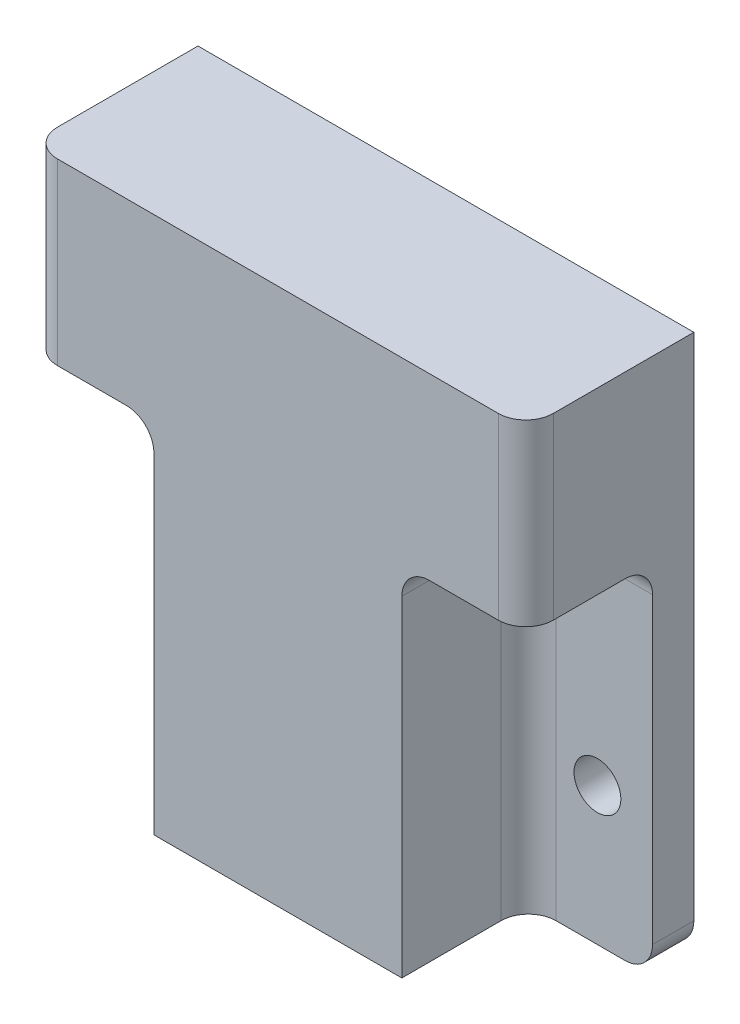
ISO-10303-21;
HEADER;
FILE_DESCRIPTION(('STEP AP214'),'2;1');
FILE_NAME('part.step','',(''),(''),'','','');
FILE_SCHEMA(('AUTOMOTIVE_DESIGN { 1 0 10303 214 1 1 1 1 }'));
ENDSEC;
DATA;
#1=APPLICATION_CONTEXT('core data for automotive mechanical design processes');
#2=APPLICATION_PROTOCOL_DEFINITION('international standard','automotive_design',2000,#1);
#3=PRODUCT_CONTEXT('',#1,'mechanical');
#4=PRODUCT('Part','Part','',(#3));
#5=PRODUCT_RELATED_PRODUCT_CATEGORY('part','',(#4));
#6=PRODUCT_DEFINITION_FORMATION('','',#4);
#7=PRODUCT_DEFINITION_CONTEXT('part definition',#1,'design');
#8=PRODUCT_DEFINITION('design','',#6,#7);
#9=PRODUCT_DEFINITION_SHAPE('','',#8);
#10=(LENGTH_UNIT() NAMED_UNIT(*) SI_UNIT(.MILLI.,.METRE.));
#11=(NAMED_UNIT(*) PLANE_ANGLE_UNIT() SI_UNIT($,.RADIAN.));
#12=(NAMED_UNIT(*) SI_UNIT($,.STERADIAN.) SOLID_ANGLE_UNIT());
#13=UNCERTAINTY_MEASURE_WITH_UNIT(LENGTH_MEASURE(1.E-05),#10,'distance_accuracy_value','');
#14=(GEOMETRIC_REPRESENTATION_CONTEXT(3) GLOBAL_UNCERTAINTY_ASSIGNED_CONTEXT((#13)) GLOBAL_UNIT_ASSIGNED_CONTEXT((#10,
#11,#12)) REPRESENTATION_CONTEXT('',''));
#15=CARTESIAN_POINT('',(0.,0.,0.));
#16=DIRECTION('',(0.,0.,1.));
#17=DIRECTION('',(1.,0.,0.));
#18=AXIS2_PLACEMENT_3D('',#15,#16,#17);
#19=CARTESIAN_POINT('',(0.,0.,3.));
#20=DIRECTION('',(0.,0.,1.));
#21=DIRECTION('',(1.,0.,0.));
#22=AXIS2_PLACEMENT_3D('',#19,#20,#21);
#23=PLANE('',#22);
#24=CARTESIAN_POINT('',(-14.,0.,3.));
#25=DIRECTION('',(0.,0.,1.));
#26=DIRECTION('',(1.,0.,0.));
#27=AXIS2_PLACEMENT_3D('',#24,#25,#26);
#28=CIRCLE('',#27,1.7);
#29=CARTESIAN_POINT('',(-12.3,0.,3.));
#30=VERTEX_POINT('',#29);
#31=EDGE_CURVE('E418',#30,#30,#28,.T.);
#32=ORIENTED_EDGE('',*,*,#31,.F.);
#33=EDGE_LOOP('',(#32));
#34=FACE_BOUND('',#33,.T.);
#35=DIRECTION('',(0.,-1.,0.));
#36=VECTOR('',#35,1.);
#37=CARTESIAN_POINT('',(-18.,0.,3.));
#38=LINE('',#37,#36);
#39=CARTESIAN_POINT('',(-18.,14.,3.));
#40=VERTEX_POINT('',#39);
#41=CARTESIAN_POINT('',(-18.,-8.,3.));
#42=VERTEX_POINT('',#41);
#43=EDGE_CURVE('E231',#40,#42,#38,.T.);
#44=ORIENTED_EDGE('',*,*,#43,.T.);
#45=CARTESIAN_POINT('',(-16.,-8.,3.));
#46=DIRECTION('',(0.,0.,1.));
#47=DIRECTION('',(1.,0.,0.));
#48=AXIS2_PLACEMENT_3D('',#45,#46,#47);
#49=CIRCLE('',#48,2.);
#50=CARTESIAN_POINT('',(-16.,-10.,3.));
#51=VERTEX_POINT('',#50);
#52=EDGE_CURVE('E11',#42,#51,#49,.T.);
#53=ORIENTED_EDGE('',*,*,#52,.T.);
#54=DIRECTION('',(-1.,0.,0.));
#55=VECTOR('',#54,1.);
#56=CARTESIAN_POINT('',(0.,-10.,3.));
#57=LINE('',#56,#55);
#58=CARTESIAN_POINT('',(-11.,-10.,3.));
#59=VERTEX_POINT('',#58);
#60=EDGE_CURVE('E400',#59,#51,#57,.T.);
#61=ORIENTED_EDGE('',*,*,#60,.F.);
#62=DIRECTION('',(0.,1.,0.));
#63=VECTOR('',#62,1.);
#64=CARTESIAN_POINT('',(-11.,16.,3.));
#65=LINE('',#64,#63);
#66=CARTESIAN_POINT('',(-11.,14.,3.));
#67=VERTEX_POINT('',#66);
#68=EDGE_CURVE('E445',#59,#67,#65,.T.);
#69=ORIENTED_EDGE('',*,*,#68,.T.);
#70=DIRECTION('',(1.,0.,0.));
#71=VECTOR('',#70,1.);
#72=CARTESIAN_POINT('',(0.,14.,3.));
#73=LINE('',#72,#71);
#74=EDGE_CURVE('E439',#67,#40,#73,.F.);
#75=ORIENTED_EDGE('',*,*,#74,.T.);
#76=EDGE_LOOP('',(#44,#53,#61,#69,#75));
#77=FACE_BOUND('',#76,.T.);
#78=ADVANCED_FACE('F47',(#34,#77),#23,.T.);
#79=CARTESIAN_POINT('',(6.5,-10.,3.));
#80=VERTEX_POINT('',#79);
#81=CARTESIAN_POINT('',(-6.5,-10.,3.));
#82=VERTEX_POINT('',#81);
#83=EDGE_CURVE('E395',#80,#82,#57,.T.);
#84=ORIENTED_EDGE('',*,*,#83,.F.);
#85=DIRECTION('',(0.,1.,0.));
#86=VECTOR('',#85,1.);
#87=CARTESIAN_POINT('',(6.5,-12.8701204345569,3.));
#88=LINE('',#87,#86);
#89=CARTESIAN_POINT('',(6.50000000000001,16.,3.));
#90=VERTEX_POINT('',#89);
#91=EDGE_CURVE('E282',#80,#90,#88,.T.);
#92=ORIENTED_EDGE('',*,*,#91,.T.);
#93=DIRECTION('',(1.,0.,0.));
#94=VECTOR('',#93,1.);
#95=CARTESIAN_POINT('',(-18.,16.,3.));
#96=LINE('',#95,#94);
#97=CARTESIAN_POINT('',(-6.50000000000001,16.,3.));
#98=VERTEX_POINT('',#97);
#99=EDGE_CURVE('E363',#98,#90,#96,.T.);
#100=ORIENTED_EDGE('',*,*,#99,.F.);
#101=DIRECTION('',(0.,1.,0.));
#102=VECTOR('',#101,1.);
#103=CARTESIAN_POINT('',(-6.5,-12.8701204345569,3.));
#104=LINE('',#103,#102);
#105=EDGE_CURVE('E398',#82,#98,#104,.T.);
#106=ORIENTED_EDGE('',*,*,#105,.F.);
#107=EDGE_LOOP('',(#84,#92,#100,#106));
#108=FACE_BOUND('',#107,.T.);
#109=ADVANCED_FACE('F523',(#108),#23,.T.);
#110=CARTESIAN_POINT('',(-6.5,-12.8701204345569,3.));
#111=DIRECTION('',(1.,0.,0.));
#112=DIRECTION('',(0.,0.,-1.));
#113=AXIS2_PLACEMENT_3D('',#110,#111,#112);
#114=PLANE('',#113);
#115=ORIENTED_EDGE('',*,*,#105,.T.);
#116=DIRECTION('',(0.,0.,1.));
#117=VECTOR('',#116,1.);
#118=CARTESIAN_POINT('',(-6.50000000000001,16.,3.));
#119=LINE('',#118,#117);
#120=CARTESIAN_POINT('',(-6.5,16.,9.));
#121=VERTEX_POINT('',#120);
#122=EDGE_CURVE('E375',#98,#121,#119,.T.);
#123=ORIENTED_EDGE('',*,*,#122,.T.);
#124=DIRECTION('',(0.,1.,0.));
#125=VECTOR('',#124,1.);
#126=CARTESIAN_POINT('',(-6.5,-12.8701204345569,9.));
#127=LINE('',#126,#125);
#128=CARTESIAN_POINT('',(-6.5,-10.,9.));
#129=VERTEX_POINT('',#128);
#130=EDGE_CURVE('E401',#129,#121,#127,.T.);
#131=ORIENTED_EDGE('',*,*,#130,.F.);
#132=DIRECTION('',(0.,0.,-1.));
#133=VECTOR('',#132,1.);
#134=CARTESIAN_POINT('',(-6.5,-10.,3.));
#135=LINE('',#134,#133);
#136=EDGE_CURVE('E385',#129,#82,#135,.T.);
#137=ORIENTED_EDGE('',*,*,#136,.T.);
#138=EDGE_LOOP('',(#115,#123,#131,#137));
#139=FACE_BOUND('',#138,.T.);
#140=ADVANCED_FACE('F535',(#139),#114,.T.);
#141=CARTESIAN_POINT('',(-6.5,-12.8701204345569,9.));
#142=DIRECTION('',(0.,0.,-1.));
#143=DIRECTION('',(-1.,0.,0.));
#144=AXIS2_PLACEMENT_3D('',#141,#142,#143);
#145=PLANE('',#144);
#146=ORIENTED_EDGE('',*,*,#130,.T.);
#147=DIRECTION('',(1.,0.,0.));
#148=VECTOR('',#147,1.);
#149=CARTESIAN_POINT('',(-6.5,16.,9.));
#150=LINE('',#149,#148);
#151=CARTESIAN_POINT('',(6.5,16.,9.));
#152=VERTEX_POINT('',#151);
#153=EDGE_CURVE('E370',#121,#152,#150,.T.);
#154=ORIENTED_EDGE('',*,*,#153,.T.);
#155=DIRECTION('',(0.,1.,0.));
#156=VECTOR('',#155,1.);
#157=CARTESIAN_POINT('',(6.5,-12.8701204345569,9.));
#158=LINE('',#157,#156);
#159=CARTESIAN_POINT('',(6.5,-10.,9.));
#160=VERTEX_POINT('',#159);
#161=EDGE_CURVE('E288',#160,#152,#158,.T.);
#162=ORIENTED_EDGE('',*,*,#161,.F.);
#163=DIRECTION('',(-1.,0.,0.));
#164=VECTOR('',#163,1.);
#165=CARTESIAN_POINT('',(-6.5,-10.,9.));
#166=LINE('',#165,#164);
#167=EDGE_CURVE('E378',#160,#129,#166,.T.);
#168=ORIENTED_EDGE('',*,*,#167,.T.);
#169=EDGE_LOOP('',(#146,#154,#162,#168));
#170=FACE_BOUND('',#169,.T.);
#171=ADVANCED_FACE('F576',(#170),#145,.T.);
#172=CARTESIAN_POINT('',(-9.,-12.8701204345569,12.2));
#173=DIRECTION('',(-1.,0.,0.));
#174=DIRECTION('',(0.,-1.,0.));
#175=AXIS2_PLACEMENT_3D('',#172,#173,#174);
#176=PLANE('',#175);
#177=DIRECTION('',(0.,1.,0.));
#178=VECTOR('',#177,1.);
#179=CARTESIAN_POINT('',(-9.,-12.8701204345569,12.2));
#180=LINE('',#179,#178);
#181=CARTESIAN_POINT('',(-9.,-10.,12.2));
#182=VERTEX_POINT('',#181);
#183=CARTESIAN_POINT('',(-9.,14.,12.2));
#184=VERTEX_POINT('',#183);
#185=EDGE_CURVE('E396',#182,#184,#180,.T.);
#186=ORIENTED_EDGE('',*,*,#185,.T.);
#187=DIRECTION('',(0.,0.,-1.));
#188=VECTOR('',#187,1.);
#189=CARTESIAN_POINT('',(-9.,14.,12.2));
#190=LINE('',#189,#188);
#191=CARTESIAN_POINT('',(-9.,14.,5.));
#192=VERTEX_POINT('',#191);
#193=EDGE_CURVE('E430',#184,#192,#190,.T.);
#194=ORIENTED_EDGE('',*,*,#193,.T.);
#195=DIRECTION('',(0.,1.,0.));
#196=VECTOR('',#195,1.);
#197=CARTESIAN_POINT('',(-9.,-10.,5.));
#198=LINE('',#197,#196);
#199=CARTESIAN_POINT('',(-9.,-10.,5.));
#200=VERTEX_POINT('',#199);
#201=EDGE_CURVE('E425',#192,#200,#198,.F.);
#202=ORIENTED_EDGE('',*,*,#201,.T.);
#203=DIRECTION('',(0.,0.,1.));
#204=VECTOR('',#203,1.);
#205=CARTESIAN_POINT('',(-9.,-10.,12.2));
#206=LINE('',#205,#204);
#207=EDGE_CURVE('E374',#200,#182,#206,.T.);
#208=ORIENTED_EDGE('',*,*,#207,.T.);
#209=EDGE_LOOP('',(#186,#194,#202,#208));
#210=FACE_BOUND('',#209,.T.);
#211=ADVANCED_FACE('F492',(#210),#176,.T.);
#212=CARTESIAN_POINT('',(0.,0.,0.));
#213=DIRECTION('',(0.,0.,1.));
#214=DIRECTION('',(1.,0.,0.));
#215=AXIS2_PLACEMENT_3D('',#212,#213,#214);
#216=PLANE('',#215);
#217=CARTESIAN_POINT('',(16.,-8.,0.));
#218=DIRECTION('',(0.,0.,-1.));
#219=DIRECTION('',(-1.,0.,0.));
#220=AXIS2_PLACEMENT_3D('',#217,#218,#219);
#221=CIRCLE('',#220,2.);
#222=CARTESIAN_POINT('',(16.,-10.,0.));
#223=VERTEX_POINT('',#222);
#224=CARTESIAN_POINT('',(18.,-8.,0.));
#225=VERTEX_POINT('',#224);
#226=EDGE_CURVE('E355',#223,#225,#221,.F.);
#227=ORIENTED_EDGE('',*,*,#226,.F.);
#228=DIRECTION('',(-1.,0.,0.));
#229=VECTOR('',#228,1.);
#230=CARTESIAN_POINT('',(0.,-10.,0.));
#231=LINE('',#230,#229);
#232=CARTESIAN_POINT('',(-16.,-10.,0.));
#233=VERTEX_POINT('',#232);
#234=EDGE_CURVE('E391',#223,#233,#231,.T.);
#235=ORIENTED_EDGE('',*,*,#234,.T.);
#236=CARTESIAN_POINT('',(-16.,-8.,0.));
#237=DIRECTION('',(0.,0.,1.));
#238=DIRECTION('',(1.,0.,0.));
#239=AXIS2_PLACEMENT_3D('',#236,#237,#238);
#240=CIRCLE('',#239,2.);
#241=CARTESIAN_POINT('',(-18.,-8.,0.));
#242=VERTEX_POINT('',#241);
#243=EDGE_CURVE('E71',#233,#242,#240,.F.);
#244=ORIENTED_EDGE('',*,*,#243,.T.);
#245=DIRECTION('',(0.,-1.,0.));
#246=VECTOR('',#245,1.);
#247=CARTESIAN_POINT('',(-18.,0.,0.));
#248=LINE('',#247,#246);
#249=CARTESIAN_POINT('',(-18.,29.,0.));
#250=VERTEX_POINT('',#249);
#251=EDGE_CURVE('E224',#250,#242,#248,.T.);
#252=ORIENTED_EDGE('',*,*,#251,.F.);
#253=DIRECTION('',(-1.,0.,0.));
#254=VECTOR('',#253,1.);
#255=CARTESIAN_POINT('',(18.,29.,0.));
#256=LINE('',#255,#254);
#257=CARTESIAN_POINT('',(18.,29.,0.));
#258=VERTEX_POINT('',#257);
#259=EDGE_CURVE('E235',#258,#250,#256,.T.);
#260=ORIENTED_EDGE('',*,*,#259,.F.);
#261=DIRECTION('',(0.,-1.,0.));
#262=VECTOR('',#261,1.);
#263=CARTESIAN_POINT('',(18.,0.,0.));
#264=LINE('',#263,#262);
#265=EDGE_CURVE('E308',#258,#225,#264,.T.);
#266=ORIENTED_EDGE('',*,*,#265,.T.);
#267=EDGE_LOOP('',(#227,#235,#244,#252,#260,#266));
#268=FACE_BOUND('',#267,.T.);
#269=CARTESIAN_POINT('',(-14.,0.,0.));
#270=DIRECTION('',(0.,0.,1.));
#271=DIRECTION('',(1.,0.,0.));
#272=AXIS2_PLACEMENT_3D('',#269,#270,#271);
#273=CIRCLE('',#272,1.7);
#274=CARTESIAN_POINT('',(-12.3,0.,0.));
#275=VERTEX_POINT('',#274);
#276=EDGE_CURVE('E234',#275,#275,#273,.T.);
#277=ORIENTED_EDGE('',*,*,#276,.T.);
#278=EDGE_LOOP('',(#277));
#279=FACE_BOUND('',#278,.T.);
#280=DIRECTION('',(1.,0.,0.));
#281=VECTOR('',#280,1.);
#282=CARTESIAN_POINT('',(0.,-3.,0.));
#283=LINE('',#282,#281);
#284=CARTESIAN_POINT('',(-8.,-3.,0.));
#285=VERTEX_POINT('',#284);
#286=CARTESIAN_POINT('',(8.,-3.,0.));
#287=VERTEX_POINT('',#286);
#288=EDGE_CURVE('E383',#285,#287,#283,.T.);
#289=ORIENTED_EDGE('',*,*,#288,.T.);
#290=DIRECTION('',(0.,1.,0.));
#291=VECTOR('',#290,1.);
#292=CARTESIAN_POINT('',(8.,0.,0.));
#293=LINE('',#292,#291);
#294=CARTESIAN_POINT('',(8.,3.,0.));
#295=VERTEX_POINT('',#294);
#296=EDGE_CURVE('E287',#287,#295,#293,.T.);
#297=ORIENTED_EDGE('',*,*,#296,.T.);
#298=DIRECTION('',(1.,0.,0.));
#299=VECTOR('',#298,1.);
#300=CARTESIAN_POINT('',(0.,3.,0.));
#301=LINE('',#300,#299);
#302=CARTESIAN_POINT('',(-8.,3.,0.));
#303=VERTEX_POINT('',#302);
#304=EDGE_CURVE('E414',#303,#295,#301,.T.);
#305=ORIENTED_EDGE('',*,*,#304,.F.);
#306=DIRECTION('',(0.,1.,0.));
#307=VECTOR('',#306,1.);
#308=CARTESIAN_POINT('',(-8.,0.,0.));
#309=LINE('',#308,#307);
#310=EDGE_CURVE('E405',#285,#303,#309,.T.);
#311=ORIENTED_EDGE('',*,*,#310,.F.);
#312=EDGE_LOOP('',(#289,#297,#305,#311));
#313=FACE_BOUND('',#312,.T.);
#314=CARTESIAN_POINT('',(14.,0.,0.));
#315=DIRECTION('',(0.,0.,-1.));
#316=DIRECTION('',(-1.,0.,0.));
#317=AXIS2_PLACEMENT_3D('',#314,#315,#316);
#318=CIRCLE('',#317,1.7);
#319=CARTESIAN_POINT('',(12.3,0.,0.));
#320=VERTEX_POINT('',#319);
#321=EDGE_CURVE('E304',#320,#320,#318,.T.);
#322=ORIENTED_EDGE('',*,*,#321,.F.);
#323=EDGE_LOOP('',(#322));
#324=FACE_BOUND('',#323,.T.);
#325=ADVANCED_FACE('F226',(#268,#279,#313,#324),#216,.F.);
#326=CARTESIAN_POINT('',(-18.,0.,3.));
#327=DIRECTION('',(1.,0.,0.));
#328=DIRECTION('',(0.,0.,-1.));
#329=AXIS2_PLACEMENT_3D('',#326,#327,#328);
#330=PLANE('',#329);
#331=ORIENTED_EDGE('',*,*,#251,.T.);
#332=DIRECTION('',(0.,0.,-1.));
#333=VECTOR('',#332,1.);
#334=CARTESIAN_POINT('',(-18.,-8.,3.));
#335=LINE('',#334,#333);
#336=EDGE_CURVE('E60',#242,#42,#335,.F.);
#337=ORIENTED_EDGE('',*,*,#336,.T.);
#338=ORIENTED_EDGE('',*,*,#43,.F.);
#339=CARTESIAN_POINT('',(-18.,14.,5.));
#340=DIRECTION('',(1.,0.,0.));
#341=DIRECTION('',(0.,0.,-1.));
#342=AXIS2_PLACEMENT_3D('',#339,#340,#341);
#343=CIRCLE('',#342,2.);
#344=CARTESIAN_POINT('',(-18.,16.,5.));
#345=VERTEX_POINT('',#344);
#346=EDGE_CURVE('E449',#40,#345,#343,.T.);
#347=ORIENTED_EDGE('',*,*,#346,.T.);
#348=DIRECTION('',(0.,0.,-1.));
#349=VECTOR('',#348,1.);
#350=CARTESIAN_POINT('',(-18.,16.,30.4482875908947));
#351=LINE('',#350,#349);
#352=CARTESIAN_POINT('',(-18.,16.,10.2));
#353=VERTEX_POINT('',#352);
#354=EDGE_CURVE('E364',#353,#345,#351,.T.);
#355=ORIENTED_EDGE('',*,*,#354,.F.);
#356=DIRECTION('',(0.,-1.,0.));
#357=VECTOR('',#356,1.);
#358=CARTESIAN_POINT('',(-18.,19.,10.2));
#359=LINE('',#358,#357);
#360=CARTESIAN_POINT('',(-18.,29.,10.2));
#361=VERTEX_POINT('',#360);
#362=EDGE_CURVE('E241',#353,#361,#359,.F.);
#363=ORIENTED_EDGE('',*,*,#362,.T.);
#364=DIRECTION('',(0.,0.,1.));
#365=VECTOR('',#364,1.);
#366=CARTESIAN_POINT('',(-18.,29.,0.));
#367=LINE('',#366,#365);
#368=EDGE_CURVE('E240',#250,#361,#367,.T.);
#369=ORIENTED_EDGE('',*,*,#368,.F.);
#370=EDGE_LOOP('',(#331,#337,#338,#347,#355,#363,#369));
#371=FACE_BOUND('',#370,.T.);
#372=ADVANCED_FACE('F238',(#371),#330,.F.);
#373=CARTESIAN_POINT('',(-14.,0.,3.));
#374=DIRECTION('',(0.,0.,1.));
#375=DIRECTION('',(1.,0.,0.));
#376=AXIS2_PLACEMENT_3D('',#373,#374,#375);
#377=CYLINDRICAL_SURFACE('',#376,1.7);
#378=ORIENTED_EDGE('',*,*,#31,.T.);
#379=EDGE_LOOP('',(#378));
#380=FACE_BOUND('',#379,.T.);
#381=ORIENTED_EDGE('',*,*,#276,.F.);
#382=EDGE_LOOP('',(#381));
#383=FACE_BOUND('',#382,.T.);
#384=ADVANCED_FACE('F540',(#380,#383),#377,.F.);
#385=CARTESIAN_POINT('',(-8.,0.,-3.));
#386=DIRECTION('',(1.,0.,0.));
#387=DIRECTION('',(0.,0.,-1.));
#388=AXIS2_PLACEMENT_3D('',#385,#386,#387);
#389=PLANE('',#388);
#390=ORIENTED_EDGE('',*,*,#310,.T.);
#391=DIRECTION('',(0.,0.,1.));
#392=VECTOR('',#391,1.);
#393=CARTESIAN_POINT('',(-8.,3.,-3.));
#394=LINE('',#393,#392);
#395=CARTESIAN_POINT('',(-8.,3.,-3.));
#396=VERTEX_POINT('',#395);
#397=EDGE_CURVE('E415',#396,#303,#394,.T.);
#398=ORIENTED_EDGE('',*,*,#397,.F.);
#399=DIRECTION('',(0.,1.,0.));
#400=VECTOR('',#399,1.);
#401=CARTESIAN_POINT('',(-8.,0.,-3.));
#402=LINE('',#401,#400);
#403=CARTESIAN_POINT('',(-8.,-3.,-3.));
#404=VERTEX_POINT('',#403);
#405=EDGE_CURVE('E407',#404,#396,#402,.T.);
#406=ORIENTED_EDGE('',*,*,#405,.F.);
#407=DIRECTION('',(0.,0.,1.));
#408=VECTOR('',#407,1.);
#409=CARTESIAN_POINT('',(-8.,-3.,-3.));
#410=LINE('',#409,#408);
#411=EDGE_CURVE('E387',#404,#285,#410,.T.);
#412=ORIENTED_EDGE('',*,*,#411,.T.);
#413=EDGE_LOOP('',(#390,#398,#406,#412));
#414=FACE_BOUND('',#413,.T.);
#415=ADVANCED_FACE('F593',(#414),#389,.F.);
#416=CARTESIAN_POINT('',(0.,3.,-3.));
#417=DIRECTION('',(0.,-1.,0.));
#418=DIRECTION('',(0.,0.,-1.));
#419=AXIS2_PLACEMENT_3D('',#416,#417,#418);
#420=PLANE('',#419);
#421=ORIENTED_EDGE('',*,*,#304,.T.);
#422=DIRECTION('',(0.,0.,1.));
#423=VECTOR('',#422,1.);
#424=CARTESIAN_POINT('',(8.,3.,-3.));
#425=LINE('',#424,#423);
#426=CARTESIAN_POINT('',(8.,3.,-3.));
#427=VERTEX_POINT('',#426);
#428=EDGE_CURVE('E300',#427,#295,#425,.T.);
#429=ORIENTED_EDGE('',*,*,#428,.F.);
#430=DIRECTION('',(1.,0.,0.));
#431=VECTOR('',#430,1.);
#432=CARTESIAN_POINT('',(0.,3.,-3.));
#433=LINE('',#432,#431);
#434=EDGE_CURVE('E409',#396,#427,#433,.T.);
#435=ORIENTED_EDGE('',*,*,#434,.F.);
#436=ORIENTED_EDGE('',*,*,#397,.T.);
#437=EDGE_LOOP('',(#421,#429,#435,#436));
#438=FACE_BOUND('',#437,.T.);
#439=ADVANCED_FACE('F591',(#438),#420,.F.);
#440=CARTESIAN_POINT('',(0.,0.,-3.));
#441=DIRECTION('',(0.,0.,1.));
#442=DIRECTION('',(1.,0.,0.));
#443=AXIS2_PLACEMENT_3D('',#440,#441,#442);
#444=PLANE('',#443);
#445=ORIENTED_EDGE('',*,*,#434,.T.);
#446=DIRECTION('',(0.,1.,0.));
#447=VECTOR('',#446,1.);
#448=CARTESIAN_POINT('',(8.,0.,-3.));
#449=LINE('',#448,#447);
#450=CARTESIAN_POINT('',(8.,-3.,-3.));
#451=VERTEX_POINT('',#450);
#452=EDGE_CURVE('E295',#451,#427,#449,.T.);
#453=ORIENTED_EDGE('',*,*,#452,.F.);
#454=DIRECTION('',(1.,0.,0.));
#455=VECTOR('',#454,1.);
#456=CARTESIAN_POINT('',(0.,-3.,-3.));
#457=LINE('',#456,#455);
#458=EDGE_CURVE('E386',#404,#451,#457,.T.);
#459=ORIENTED_EDGE('',*,*,#458,.F.);
#460=ORIENTED_EDGE('',*,*,#405,.T.);
#461=EDGE_LOOP('',(#445,#453,#459,#460));
#462=FACE_BOUND('',#461,.T.);
#463=ADVANCED_FACE('F589',(#462),#444,.F.);
#464=CARTESIAN_POINT('',(0.,-12.8701204345569,12.2));
#465=DIRECTION('',(0.,0.,1.));
#466=DIRECTION('',(1.,0.,0.));
#467=AXIS2_PLACEMENT_3D('',#464,#465,#466);
#468=PLANE('',#467);
#469=DIRECTION('',(0.,-1.,0.));
#470=VECTOR('',#469,1.);
#471=CARTESIAN_POINT('',(16.,16.,12.2));
#472=LINE('',#471,#470);
#473=CARTESIAN_POINT('',(16.,29.,12.2));
#474=VERTEX_POINT('',#473);
#475=CARTESIAN_POINT('',(16.,16.,12.2));
#476=VERTEX_POINT('',#475);
#477=EDGE_CURVE('E329',#474,#476,#472,.T.);
#478=ORIENTED_EDGE('',*,*,#477,.F.);
#479=DIRECTION('',(1.,0.,0.));
#480=VECTOR('',#479,1.);
#481=CARTESIAN_POINT('',(-16.,29.,12.2));
#482=LINE('',#481,#480);
#483=CARTESIAN_POINT('',(-16.,29.,12.2));
#484=VERTEX_POINT('',#483);
#485=EDGE_CURVE('E253',#484,#474,#482,.T.);
#486=ORIENTED_EDGE('',*,*,#485,.F.);
#487=DIRECTION('',(0.,-1.,0.));
#488=VECTOR('',#487,1.);
#489=CARTESIAN_POINT('',(-16.,16.,12.2));
#490=LINE('',#489,#488);
#491=CARTESIAN_POINT('',(-16.,16.,12.2));
#492=VERTEX_POINT('',#491);
#493=EDGE_CURVE('E436',#484,#492,#490,.T.);
#494=ORIENTED_EDGE('',*,*,#493,.T.);
#495=DIRECTION('',(1.,0.,0.));
#496=VECTOR('',#495,1.);
#497=CARTESIAN_POINT('',(-18.,16.,12.2));
#498=LINE('',#497,#496);
#499=CARTESIAN_POINT('',(-11.,16.,12.2));
#500=VERTEX_POINT('',#499);
#501=EDGE_CURVE('E361',#492,#500,#498,.T.);
#502=ORIENTED_EDGE('',*,*,#501,.T.);
#503=CARTESIAN_POINT('',(-11.,14.,12.2));
#504=DIRECTION('',(0.,0.,1.));
#505=DIRECTION('',(1.,0.,0.));
#506=AXIS2_PLACEMENT_3D('',#503,#504,#505);
#507=CIRCLE('',#506,2.);
#508=EDGE_CURVE('E443',#500,#184,#507,.F.);
#509=ORIENTED_EDGE('',*,*,#508,.T.);
#510=ORIENTED_EDGE('',*,*,#185,.F.);
#511=DIRECTION('',(1.,0.,0.));
#512=VECTOR('',#511,1.);
#513=CARTESIAN_POINT('',(0.,-10.,12.2));
#514=LINE('',#513,#512);
#515=CARTESIAN_POINT('',(9.,-10.,12.2));
#516=VERTEX_POINT('',#515);
#517=EDGE_CURVE('E380',#182,#516,#514,.T.);
#518=ORIENTED_EDGE('',*,*,#517,.T.);
#519=DIRECTION('',(0.,1.,0.));
#520=VECTOR('',#519,1.);
#521=CARTESIAN_POINT('',(9.,-12.8701204345569,12.2));
#522=LINE('',#521,#520);
#523=CARTESIAN_POINT('',(9.,14.,12.2));
#524=VERTEX_POINT('',#523);
#525=EDGE_CURVE('E283',#516,#524,#522,.T.);
#526=ORIENTED_EDGE('',*,*,#525,.T.);
#527=CARTESIAN_POINT('',(11.,14.,12.2));
#528=DIRECTION('',(0.,0.,-1.));
#529=DIRECTION('',(-1.,0.,0.));
#530=AXIS2_PLACEMENT_3D('',#527,#528,#529);
#531=CIRCLE('',#530,2.);
#532=CARTESIAN_POINT('',(11.,16.,12.2));
#533=VERTEX_POINT('',#532);
#534=EDGE_CURVE('E340',#533,#524,#531,.F.);
#535=ORIENTED_EDGE('',*,*,#534,.F.);
#536=DIRECTION('',(-1.,0.,0.));
#537=VECTOR('',#536,1.);
#538=CARTESIAN_POINT('',(18.,16.,12.2));
#539=LINE('',#538,#537);
#540=EDGE_CURVE('E261',#476,#533,#539,.T.);
#541=ORIENTED_EDGE('',*,*,#540,.F.);
#542=EDGE_LOOP('',(#478,#486,#494,#502,#509,#510,#518,#526,#535,#541));
#543=FACE_BOUND('',#542,.T.);
#544=ADVANCED_FACE('F489',(#543),#468,.T.);
#545=CARTESIAN_POINT('',(0.,-10.,3.));
#546=DIRECTION('',(0.,1.,0.));
#547=DIRECTION('',(0.,0.,-1.));
#548=AXIS2_PLACEMENT_3D('',#545,#546,#547);
#549=PLANE('',#548);
#550=ORIENTED_EDGE('',*,*,#234,.F.);
#551=DIRECTION('',(0.,0.,-1.));
#552=VECTOR('',#551,1.);
#553=CARTESIAN_POINT('',(16.,-10.,3.));
#554=LINE('',#553,#552);
#555=CARTESIAN_POINT('',(16.,-10.,3.));
#556=VERTEX_POINT('',#555);
#557=EDGE_CURVE('E343',#556,#223,#554,.T.);
#558=ORIENTED_EDGE('',*,*,#557,.F.);
#559=DIRECTION('',(1.,0.,0.));
#560=VECTOR('',#559,1.);
#561=CARTESIAN_POINT('',(0.,-10.,3.));
#562=LINE('',#561,#560);
#563=CARTESIAN_POINT('',(11.,-10.,3.));
#564=VERTEX_POINT('',#563);
#565=EDGE_CURVE('E284',#564,#556,#562,.T.);
#566=ORIENTED_EDGE('',*,*,#565,.F.);
#567=CARTESIAN_POINT('',(11.,-10.,5.));
#568=DIRECTION('',(0.,-1.,0.));
#569=DIRECTION('',(1.,0.,0.));
#570=AXIS2_PLACEMENT_3D('',#567,#568,#569);
#571=CIRCLE('',#570,2.);
#572=CARTESIAN_POINT('',(9.,-10.,5.));
#573=VERTEX_POINT('',#572);
#574=EDGE_CURVE('E339',#573,#564,#571,.T.);
#575=ORIENTED_EDGE('',*,*,#574,.F.);
#576=DIRECTION('',(0.,0.,1.));
#577=VECTOR('',#576,1.);
#578=CARTESIAN_POINT('',(9.,-10.,12.2));
#579=LINE('',#578,#577);
#580=EDGE_CURVE('E275',#573,#516,#579,.T.);
#581=ORIENTED_EDGE('',*,*,#580,.T.);
#582=ORIENTED_EDGE('',*,*,#517,.F.);
#583=ORIENTED_EDGE('',*,*,#207,.F.);
#584=CARTESIAN_POINT('',(-11.,-10.,5.));
#585=DIRECTION('',(0.,1.,0.));
#586=DIRECTION('',(-1.,0.,0.));
#587=AXIS2_PLACEMENT_3D('',#584,#585,#586);
#588=CIRCLE('',#587,2.);
#589=EDGE_CURVE('E447',#200,#59,#588,.T.);
#590=ORIENTED_EDGE('',*,*,#589,.T.);
#591=ORIENTED_EDGE('',*,*,#60,.T.);
#592=DIRECTION('',(0.,0.,-1.));
#593=VECTOR('',#592,1.);
#594=CARTESIAN_POINT('',(-16.,-10.,3.));
#595=LINE('',#594,#593);
#596=EDGE_CURVE('E448',#51,#233,#595,.T.);
#597=ORIENTED_EDGE('',*,*,#596,.T.);
#598=EDGE_LOOP('',(#550,#558,#566,#575,#581,#582,#583,#590,#591,#597));
#599=FACE_BOUND('',#598,.T.);
#600=DIRECTION('',(0.,0.,-1.));
#601=VECTOR('',#600,1.);
#602=CARTESIAN_POINT('',(6.5,-10.,3.));
#603=LINE('',#602,#601);
#604=EDGE_CURVE('E273',#160,#80,#603,.T.);
#605=ORIENTED_EDGE('',*,*,#604,.T.);
#606=ORIENTED_EDGE('',*,*,#83,.T.);
#607=ORIENTED_EDGE('',*,*,#136,.F.);
#608=ORIENTED_EDGE('',*,*,#167,.F.);
#609=EDGE_LOOP('',(#605,#606,#607,#608));
#610=FACE_BOUND('',#609,.T.);
#611=ADVANCED_FACE('F465',(#599,#610),#549,.F.);
#612=CARTESIAN_POINT('',(0.,-3.,-3.));
#613=DIRECTION('',(0.,1.,0.));
#614=DIRECTION('',(0.,0.,-1.));
#615=AXIS2_PLACEMENT_3D('',#612,#613,#614);
#616=PLANE('',#615);
#617=ORIENTED_EDGE('',*,*,#288,.F.);
#618=ORIENTED_EDGE('',*,*,#411,.F.);
#619=ORIENTED_EDGE('',*,*,#458,.T.);
#620=DIRECTION('',(0.,0.,1.));
#621=VECTOR('',#620,1.);
#622=CARTESIAN_POINT('',(8.,-3.,-3.));
#623=LINE('',#622,#621);
#624=EDGE_CURVE('E277',#451,#287,#623,.T.);
#625=ORIENTED_EDGE('',*,*,#624,.T.);
#626=EDGE_LOOP('',(#617,#618,#619,#625));
#627=FACE_BOUND('',#626,.T.);
#628=ADVANCED_FACE('F566',(#627),#616,.F.);
#629=CARTESIAN_POINT('',(-18.,16.,30.4482875908947));
#630=DIRECTION('',(0.,1.,0.));
#631=DIRECTION('',(-1.,0.,0.));
#632=AXIS2_PLACEMENT_3D('',#629,#630,#631);
#633=PLANE('',#632);
#634=ORIENTED_EDGE('',*,*,#122,.F.);
#635=ORIENTED_EDGE('',*,*,#99,.T.);
#636=DIRECTION('',(0.,0.,1.));
#637=VECTOR('',#636,1.);
#638=CARTESIAN_POINT('',(6.50000000000001,16.,3.));
#639=LINE('',#638,#637);
#640=EDGE_CURVE('E262',#90,#152,#639,.T.);
#641=ORIENTED_EDGE('',*,*,#640,.T.);
#642=ORIENTED_EDGE('',*,*,#153,.F.);
#643=EDGE_LOOP('',(#634,#635,#641,#642));
#644=FACE_BOUND('',#643,.T.);
#645=ADVANCED_FACE('F560',(#644),#633,.F.);
#646=ORIENTED_EDGE('',*,*,#501,.F.);
#647=CARTESIAN_POINT('',(-16.,16.,10.2));
#648=DIRECTION('',(0.,1.,0.));
#649=DIRECTION('',(-1.,0.,0.));
#650=AXIS2_PLACEMENT_3D('',#647,#648,#649);
#651=CIRCLE('',#650,2.);
#652=EDGE_CURVE('E432',#492,#353,#651,.F.);
#653=ORIENTED_EDGE('',*,*,#652,.T.);
#654=ORIENTED_EDGE('',*,*,#354,.T.);
#655=DIRECTION('',(1.,0.,0.));
#656=VECTOR('',#655,1.);
#657=CARTESIAN_POINT('',(-18.,16.,5.));
#658=LINE('',#657,#656);
#659=CARTESIAN_POINT('',(-11.,16.,5.));
#660=VERTEX_POINT('',#659);
#661=EDGE_CURVE('E427',#345,#660,#658,.T.);
#662=ORIENTED_EDGE('',*,*,#661,.T.);
#663=DIRECTION('',(0.,0.,-1.));
#664=VECTOR('',#663,1.);
#665=CARTESIAN_POINT('',(-11.,16.,30.4482875908947));
#666=LINE('',#665,#664);
#667=EDGE_CURVE('E435',#660,#500,#666,.F.);
#668=ORIENTED_EDGE('',*,*,#667,.T.);
#669=EDGE_LOOP('',(#646,#653,#654,#662,#668));
#670=FACE_BOUND('',#669,.T.);
#671=ADVANCED_FACE('F552',(#670),#633,.F.);
#672=CARTESIAN_POINT('',(-11.,0.,5.));
#673=DIRECTION('',(0.,-1.,0.));
#674=DIRECTION('',(1.,0.,0.));
#675=AXIS2_PLACEMENT_3D('',#672,#673,#674);
#676=CYLINDRICAL_SURFACE('',#675,2.);
#677=ORIENTED_EDGE('',*,*,#589,.F.);
#678=ORIENTED_EDGE('',*,*,#201,.F.);
#679=CARTESIAN_POINT('',(-11.,14.,5.));
#680=DIRECTION('',(0.,-1.,0.));
#681=DIRECTION('',(0.,0.,-1.));
#682=AXIS2_PLACEMENT_3D('',#679,#680,#681);
#683=CIRCLE('',#682,2.);
#684=EDGE_CURVE('E369',#67,#192,#683,.T.);
#685=ORIENTED_EDGE('',*,*,#684,.F.);
#686=ORIENTED_EDGE('',*,*,#68,.F.);
#687=EDGE_LOOP('',(#677,#678,#685,#686));
#688=FACE_BOUND('',#687,.T.);
#689=ADVANCED_FACE('F510',(#688),#676,.F.);
#690=CARTESIAN_POINT('',(-18.,14.,5.));
#691=DIRECTION('',(1.,0.,0.));
#692=DIRECTION('',(0.,1.,0.));
#693=AXIS2_PLACEMENT_3D('',#690,#691,#692);
#694=CYLINDRICAL_SURFACE('',#693,2.);
#695=ORIENTED_EDGE('',*,*,#346,.F.);
#696=ORIENTED_EDGE('',*,*,#74,.F.);
#697=CARTESIAN_POINT('',(-11.,14.,5.));
#698=DIRECTION('',(-1.,0.,0.));
#699=DIRECTION('',(0.,0.,1.));
#700=AXIS2_PLACEMENT_3D('',#697,#698,#699);
#701=CIRCLE('',#700,2.);
#702=EDGE_CURVE('E455',#660,#67,#701,.T.);
#703=ORIENTED_EDGE('',*,*,#702,.F.);
#704=ORIENTED_EDGE('',*,*,#661,.F.);
#705=EDGE_LOOP('',(#695,#696,#703,#704));
#706=FACE_BOUND('',#705,.T.);
#707=ADVANCED_FACE('F550',(#706),#694,.F.);
#708=CARTESIAN_POINT('',(-11.,14.,5.));
#709=DIRECTION('',(0.,0.,1.));
#710=DIRECTION('',(1.,0.,0.));
#711=AXIS2_PLACEMENT_3D('',#708,#709,#710);
#712=SPHERICAL_SURFACE('',#711,2.);
#713=ORIENTED_EDGE('',*,*,#702,.T.);
#714=ORIENTED_EDGE('',*,*,#684,.T.);
#715=CARTESIAN_POINT('',(-11.,14.,5.));
#716=DIRECTION('',(0.,0.,1.));
#717=DIRECTION('',(0.,-1.,0.));
#718=AXIS2_PLACEMENT_3D('',#715,#716,#717);
#719=CIRCLE('',#718,2.);
#720=EDGE_CURVE('E359',#660,#192,#719,.F.);
#721=ORIENTED_EDGE('',*,*,#720,.F.);
#722=EDGE_LOOP('',(#713,#714,#721));
#723=FACE_BOUND('',#722,.T.);
#724=ADVANCED_FACE('F503',(#723),#712,.F.);
#725=CARTESIAN_POINT('',(-11.,14.,12.2));
#726=DIRECTION('',(0.,0.,-1.));
#727=DIRECTION('',(-1.,0.,0.));
#728=AXIS2_PLACEMENT_3D('',#725,#726,#727);
#729=CYLINDRICAL_SURFACE('',#728,2.);
#730=ORIENTED_EDGE('',*,*,#508,.F.);
#731=ORIENTED_EDGE('',*,*,#667,.F.);
#732=ORIENTED_EDGE('',*,*,#720,.T.);
#733=ORIENTED_EDGE('',*,*,#193,.F.);
#734=EDGE_LOOP('',(#730,#731,#732,#733));
#735=FACE_BOUND('',#734,.T.);
#736=ADVANCED_FACE('F500',(#735),#729,.F.);
#737=CARTESIAN_POINT('',(-16.,-12.8701204345569,10.2));
#738=DIRECTION('',(0.,1.,0.));
#739=DIRECTION('',(0.,0.,1.));
#740=AXIS2_PLACEMENT_3D('',#737,#738,#739);
#741=CYLINDRICAL_SURFACE('',#740,2.);
#742=ORIENTED_EDGE('',*,*,#493,.F.);
#743=CARTESIAN_POINT('',(-16.,29.,10.2));
#744=DIRECTION('',(0.,1.,0.));
#745=DIRECTION('',(0.,0.,1.));
#746=AXIS2_PLACEMENT_3D('',#743,#744,#745);
#747=CIRCLE('',#746,2.);
#748=EDGE_CURVE('E244',#361,#484,#747,.T.);
#749=ORIENTED_EDGE('',*,*,#748,.F.);
#750=ORIENTED_EDGE('',*,*,#362,.F.);
#751=ORIENTED_EDGE('',*,*,#652,.F.);
#752=EDGE_LOOP('',(#742,#749,#750,#751));
#753=FACE_BOUND('',#752,.T.);
#754=ADVANCED_FACE('F512',(#753),#741,.T.);
#755=CARTESIAN_POINT('',(-16.,-8.,3.));
#756=DIRECTION('',(0.,0.,-1.));
#757=DIRECTION('',(-1.,0.,0.));
#758=AXIS2_PLACEMENT_3D('',#755,#756,#757);
#759=CYLINDRICAL_SURFACE('',#758,2.);
#760=ORIENTED_EDGE('',*,*,#52,.F.);
#761=ORIENTED_EDGE('',*,*,#336,.F.);
#762=ORIENTED_EDGE('',*,*,#243,.F.);
#763=ORIENTED_EDGE('',*,*,#596,.F.);
#764=EDGE_LOOP('',(#760,#761,#762,#763));
#765=FACE_BOUND('',#764,.T.);
#766=ADVANCED_FACE('F51',(#765),#759,.T.);
#767=CARTESIAN_POINT('',(0.,0.,3.));
#768=DIRECTION('',(0.,0.,1.));
#769=DIRECTION('',(-1.,0.,0.));
#770=AXIS2_PLACEMENT_3D('',#767,#768,#769);
#771=PLANE('',#770);
#772=CARTESIAN_POINT('',(14.,0.,3.));
#773=DIRECTION('',(0.,0.,-1.));
#774=DIRECTION('',(-1.,0.,0.));
#775=AXIS2_PLACEMENT_3D('',#772,#773,#774);
#776=CIRCLE('',#775,1.7);
#777=CARTESIAN_POINT('',(12.3,0.,3.));
#778=VERTEX_POINT('',#777);
#779=EDGE_CURVE('E305',#778,#778,#776,.T.);
#780=ORIENTED_EDGE('',*,*,#779,.T.);
#781=EDGE_LOOP('',(#780));
#782=FACE_BOUND('',#781,.T.);
#783=DIRECTION('',(0.,-1.,0.));
#784=VECTOR('',#783,1.);
#785=CARTESIAN_POINT('',(18.,0.,3.));
#786=LINE('',#785,#784);
#787=CARTESIAN_POINT('',(18.,14.,3.));
#788=VERTEX_POINT('',#787);
#789=CARTESIAN_POINT('',(18.,-8.,3.));
#790=VERTEX_POINT('',#789);
#791=EDGE_CURVE('E307',#788,#790,#786,.T.);
#792=ORIENTED_EDGE('',*,*,#791,.F.);
#793=DIRECTION('',(-1.,0.,0.));
#794=VECTOR('',#793,1.);
#795=CARTESIAN_POINT('',(0.,14.,3.));
#796=LINE('',#795,#794);
#797=CARTESIAN_POINT('',(11.,14.,3.));
#798=VERTEX_POINT('',#797);
#799=EDGE_CURVE('E331',#798,#788,#796,.F.);
#800=ORIENTED_EDGE('',*,*,#799,.F.);
#801=DIRECTION('',(0.,1.,0.));
#802=VECTOR('',#801,1.);
#803=CARTESIAN_POINT('',(11.,16.,3.));
#804=LINE('',#803,#802);
#805=EDGE_CURVE('E333',#564,#798,#804,.T.);
#806=ORIENTED_EDGE('',*,*,#805,.F.);
#807=ORIENTED_EDGE('',*,*,#565,.T.);
#808=CARTESIAN_POINT('',(16.,-8.,3.));
#809=DIRECTION('',(0.,0.,-1.));
#810=DIRECTION('',(-1.,0.,0.));
#811=AXIS2_PLACEMENT_3D('',#808,#809,#810);
#812=CIRCLE('',#811,2.);
#813=EDGE_CURVE('E357',#790,#556,#812,.T.);
#814=ORIENTED_EDGE('',*,*,#813,.F.);
#815=EDGE_LOOP('',(#792,#800,#806,#807,#814));
#816=FACE_BOUND('',#815,.T.);
#817=ADVANCED_FACE('F474',(#782,#816),#771,.T.);
#818=CARTESIAN_POINT('',(6.5,-12.8701204345569,3.));
#819=DIRECTION('',(-1.,0.,0.));
#820=DIRECTION('',(0.,0.,-1.));
#821=AXIS2_PLACEMENT_3D('',#818,#819,#820);
#822=PLANE('',#821);
#823=ORIENTED_EDGE('',*,*,#91,.F.);
#824=ORIENTED_EDGE('',*,*,#604,.F.);
#825=ORIENTED_EDGE('',*,*,#161,.T.);
#826=ORIENTED_EDGE('',*,*,#640,.F.);
#827=EDGE_LOOP('',(#823,#824,#825,#826));
#828=FACE_BOUND('',#827,.T.);
#829=ADVANCED_FACE('F517',(#828),#822,.T.);
#830=CARTESIAN_POINT('',(9.,-12.8701204345569,12.2));
#831=DIRECTION('',(1.,0.,0.));
#832=DIRECTION('',(0.,-1.,0.));
#833=AXIS2_PLACEMENT_3D('',#830,#831,#832);
#834=PLANE('',#833);
#835=ORIENTED_EDGE('',*,*,#525,.F.);
#836=ORIENTED_EDGE('',*,*,#580,.F.);
#837=DIRECTION('',(0.,1.,0.));
#838=VECTOR('',#837,1.);
#839=CARTESIAN_POINT('',(9.,-10.,5.));
#840=LINE('',#839,#838);
#841=CARTESIAN_POINT('',(9.,14.,5.));
#842=VERTEX_POINT('',#841);
#843=EDGE_CURVE('E315',#842,#573,#840,.F.);
#844=ORIENTED_EDGE('',*,*,#843,.F.);
#845=DIRECTION('',(0.,0.,-1.));
#846=VECTOR('',#845,1.);
#847=CARTESIAN_POINT('',(9.,14.,12.2));
#848=LINE('',#847,#846);
#849=EDGE_CURVE('E317',#524,#842,#848,.T.);
#850=ORIENTED_EDGE('',*,*,#849,.F.);
#851=EDGE_LOOP('',(#835,#836,#844,#850));
#852=FACE_BOUND('',#851,.T.);
#853=ADVANCED_FACE('F483',(#852),#834,.T.);
#854=CARTESIAN_POINT('',(18.,0.,3.));
#855=DIRECTION('',(-1.,0.,0.));
#856=DIRECTION('',(0.,0.,-1.));
#857=AXIS2_PLACEMENT_3D('',#854,#855,#856);
#858=PLANE('',#857);
#859=ORIENTED_EDGE('',*,*,#265,.F.);
#860=DIRECTION('',(0.,0.,-1.));
#861=VECTOR('',#860,1.);
#862=CARTESIAN_POINT('',(18.,29.,10.2));
#863=LINE('',#862,#861);
#864=CARTESIAN_POINT('',(18.,29.,10.2));
#865=VERTEX_POINT('',#864);
#866=EDGE_CURVE('E252',#865,#258,#863,.T.);
#867=ORIENTED_EDGE('',*,*,#866,.F.);
#868=DIRECTION('',(0.,-1.,0.));
#869=VECTOR('',#868,1.);
#870=CARTESIAN_POINT('',(18.,19.,10.2));
#871=LINE('',#870,#869);
#872=CARTESIAN_POINT('',(18.,16.,10.2));
#873=VERTEX_POINT('',#872);
#874=EDGE_CURVE('E328',#873,#865,#871,.F.);
#875=ORIENTED_EDGE('',*,*,#874,.F.);
#876=DIRECTION('',(0.,0.,-1.));
#877=VECTOR('',#876,1.);
#878=CARTESIAN_POINT('',(18.,16.,30.4482875908947));
#879=LINE('',#878,#877);
#880=CARTESIAN_POINT('',(18.,16.,5.));
#881=VERTEX_POINT('',#880);
#882=EDGE_CURVE('E266',#873,#881,#879,.T.);
#883=ORIENTED_EDGE('',*,*,#882,.T.);
#884=CARTESIAN_POINT('',(18.,14.,5.));
#885=DIRECTION('',(1.,0.,0.));
#886=DIRECTION('',(0.,0.,-1.));
#887=AXIS2_PLACEMENT_3D('',#884,#885,#886);
#888=CIRCLE('',#887,2.);
#889=EDGE_CURVE('E341',#788,#881,#888,.T.);
#890=ORIENTED_EDGE('',*,*,#889,.F.);
#891=ORIENTED_EDGE('',*,*,#791,.T.);
#892=DIRECTION('',(0.,0.,-1.));
#893=VECTOR('',#892,1.);
#894=CARTESIAN_POINT('',(18.,-8.,3.));
#895=LINE('',#894,#893);
#896=EDGE_CURVE('E354',#225,#790,#895,.F.);
#897=ORIENTED_EDGE('',*,*,#896,.F.);
#898=EDGE_LOOP('',(#859,#867,#875,#883,#890,#891,#897));
#899=FACE_BOUND('',#898,.T.);
#900=ADVANCED_FACE('F630',(#899),#858,.F.);
#901=CARTESIAN_POINT('',(14.,0.,3.));
#902=DIRECTION('',(0.,0.,1.));
#903=DIRECTION('',(-1.,0.,0.));
#904=AXIS2_PLACEMENT_3D('',#901,#902,#903);
#905=CYLINDRICAL_SURFACE('',#904,1.7);
#906=ORIENTED_EDGE('',*,*,#779,.F.);
#907=EDGE_LOOP('',(#906));
#908=FACE_BOUND('',#907,.T.);
#909=ORIENTED_EDGE('',*,*,#321,.T.);
#910=EDGE_LOOP('',(#909));
#911=FACE_BOUND('',#910,.T.);
#912=ADVANCED_FACE('F620',(#908,#911),#905,.F.);
#913=CARTESIAN_POINT('',(8.,0.,-3.));
#914=DIRECTION('',(-1.,0.,0.));
#915=DIRECTION('',(0.,0.,-1.));
#916=AXIS2_PLACEMENT_3D('',#913,#914,#915);
#917=PLANE('',#916);
#918=ORIENTED_EDGE('',*,*,#296,.F.);
#919=ORIENTED_EDGE('',*,*,#624,.F.);
#920=ORIENTED_EDGE('',*,*,#452,.T.);
#921=ORIENTED_EDGE('',*,*,#428,.T.);
#922=EDGE_LOOP('',(#918,#919,#920,#921));
#923=FACE_BOUND('',#922,.T.);
#924=ADVANCED_FACE('F618',(#923),#917,.F.);
#925=CARTESIAN_POINT('',(18.,16.,30.4482875908947));
#926=DIRECTION('',(0.,1.,0.));
#927=DIRECTION('',(1.,0.,0.));
#928=AXIS2_PLACEMENT_3D('',#925,#926,#927);
#929=PLANE('',#928);
#930=ORIENTED_EDGE('',*,*,#540,.T.);
#931=DIRECTION('',(0.,0.,-1.));
#932=VECTOR('',#931,1.);
#933=CARTESIAN_POINT('',(11.,16.,30.4482875908947));
#934=LINE('',#933,#932);
#935=CARTESIAN_POINT('',(11.,16.,5.));
#936=VERTEX_POINT('',#935);
#937=EDGE_CURVE('E325',#936,#533,#934,.F.);
#938=ORIENTED_EDGE('',*,*,#937,.F.);
#939=DIRECTION('',(-1.,0.,0.));
#940=VECTOR('',#939,1.);
#941=CARTESIAN_POINT('',(18.,16.,5.));
#942=LINE('',#941,#940);
#943=EDGE_CURVE('E316',#881,#936,#942,.T.);
#944=ORIENTED_EDGE('',*,*,#943,.F.);
#945=ORIENTED_EDGE('',*,*,#882,.F.);
#946=CARTESIAN_POINT('',(16.,16.,10.2));
#947=DIRECTION('',(0.,-1.,0.));
#948=DIRECTION('',(1.,0.,0.));
#949=AXIS2_PLACEMENT_3D('',#946,#947,#948);
#950=CIRCLE('',#949,2.);
#951=EDGE_CURVE('E323',#476,#873,#950,.F.);
#952=ORIENTED_EDGE('',*,*,#951,.F.);
#953=EDGE_LOOP('',(#930,#938,#944,#945,#952));
#954=FACE_BOUND('',#953,.T.);
#955=ADVANCED_FACE('F616',(#954),#929,.F.);
#956=CARTESIAN_POINT('',(11.,0.,5.));
#957=DIRECTION('',(0.,-1.,0.));
#958=DIRECTION('',(-1.,0.,0.));
#959=AXIS2_PLACEMENT_3D('',#956,#957,#958);
#960=CYLINDRICAL_SURFACE('',#959,2.);
#961=ORIENTED_EDGE('',*,*,#574,.T.);
#962=ORIENTED_EDGE('',*,*,#805,.T.);
#963=CARTESIAN_POINT('',(11.,14.,5.));
#964=DIRECTION('',(0.,1.,0.));
#965=DIRECTION('',(0.,0.,-1.));
#966=AXIS2_PLACEMENT_3D('',#963,#964,#965);
#967=CIRCLE('',#966,2.);
#968=EDGE_CURVE('E268',#798,#842,#967,.T.);
#969=ORIENTED_EDGE('',*,*,#968,.T.);
#970=ORIENTED_EDGE('',*,*,#843,.T.);
#971=EDGE_LOOP('',(#961,#962,#969,#970));
#972=FACE_BOUND('',#971,.T.);
#973=ADVANCED_FACE('F476',(#972),#960,.F.);
#974=CARTESIAN_POINT('',(18.,14.,5.));
#975=DIRECTION('',(-1.,0.,0.));
#976=DIRECTION('',(0.,1.,0.));
#977=AXIS2_PLACEMENT_3D('',#974,#975,#976);
#978=CYLINDRICAL_SURFACE('',#977,2.);
#979=ORIENTED_EDGE('',*,*,#889,.T.);
#980=ORIENTED_EDGE('',*,*,#943,.T.);
#981=CARTESIAN_POINT('',(11.,14.,5.));
#982=DIRECTION('',(-1.,0.,0.));
#983=DIRECTION('',(0.,0.,1.));
#984=AXIS2_PLACEMENT_3D('',#981,#982,#983);
#985=CIRCLE('',#984,2.);
#986=EDGE_CURVE('E349',#936,#798,#985,.T.);
#987=ORIENTED_EDGE('',*,*,#986,.T.);
#988=ORIENTED_EDGE('',*,*,#799,.T.);
#989=EDGE_LOOP('',(#979,#980,#987,#988));
#990=FACE_BOUND('',#989,.T.);
#991=ADVANCED_FACE('F641',(#990),#978,.F.);
#992=CARTESIAN_POINT('',(11.,14.,5.));
#993=DIRECTION('',(0.,0.,1.));
#994=DIRECTION('',(-1.,0.,0.));
#995=AXIS2_PLACEMENT_3D('',#992,#993,#994);
#996=SPHERICAL_SURFACE('',#995,2.);
#997=ORIENTED_EDGE('',*,*,#986,.F.);
#998=CARTESIAN_POINT('',(11.,14.,5.));
#999=DIRECTION('',(0.,0.,-1.));
#1000=DIRECTION('',(0.,-1.,0.));
#1001=AXIS2_PLACEMENT_3D('',#998,#999,#1000);
#1002=CIRCLE('',#1001,2.);
#1003=EDGE_CURVE('E264',#936,#842,#1002,.F.);
#1004=ORIENTED_EDGE('',*,*,#1003,.T.);
#1005=ORIENTED_EDGE('',*,*,#968,.F.);
#1006=EDGE_LOOP('',(#997,#1004,#1005));
#1007=FACE_BOUND('',#1006,.T.);
#1008=ADVANCED_FACE('F639',(#1007),#996,.F.);
#1009=CARTESIAN_POINT('',(11.,14.,12.2));
#1010=DIRECTION('',(0.,0.,-1.));
#1011=DIRECTION('',(1.,0.,0.));
#1012=AXIS2_PLACEMENT_3D('',#1009,#1010,#1011);
#1013=CYLINDRICAL_SURFACE('',#1012,2.);
#1014=ORIENTED_EDGE('',*,*,#534,.T.);
#1015=ORIENTED_EDGE('',*,*,#849,.T.);
#1016=ORIENTED_EDGE('',*,*,#1003,.F.);
#1017=ORIENTED_EDGE('',*,*,#937,.T.);
#1018=EDGE_LOOP('',(#1014,#1015,#1016,#1017));
#1019=FACE_BOUND('',#1018,.T.);
#1020=ADVANCED_FACE('F636',(#1019),#1013,.F.);
#1021=CARTESIAN_POINT('',(16.,-12.8701204345569,10.2));
#1022=DIRECTION('',(0.,1.,0.));
#1023=DIRECTION('',(0.,0.,1.));
#1024=AXIS2_PLACEMENT_3D('',#1021,#1022,#1023);
#1025=CYLINDRICAL_SURFACE('',#1024,2.);
#1026=ORIENTED_EDGE('',*,*,#874,.T.);
#1027=CARTESIAN_POINT('',(16.,29.,10.2));
#1028=DIRECTION('',(0.,1.,0.));
#1029=DIRECTION('',(0.,0.,1.));
#1030=AXIS2_PLACEMENT_3D('',#1027,#1028,#1029);
#1031=CIRCLE('',#1030,2.);
#1032=EDGE_CURVE('E257',#474,#865,#1031,.T.);
#1033=ORIENTED_EDGE('',*,*,#1032,.F.);
#1034=ORIENTED_EDGE('',*,*,#477,.T.);
#1035=ORIENTED_EDGE('',*,*,#951,.T.);
#1036=EDGE_LOOP('',(#1026,#1033,#1034,#1035));
#1037=FACE_BOUND('',#1036,.T.);
#1038=ADVANCED_FACE('F638',(#1037),#1025,.T.);
#1039=CARTESIAN_POINT('',(16.,-8.,3.));
#1040=DIRECTION('',(0.,0.,-1.));
#1041=DIRECTION('',(1.,0.,0.));
#1042=AXIS2_PLACEMENT_3D('',#1039,#1040,#1041);
#1043=CYLINDRICAL_SURFACE('',#1042,2.);
#1044=ORIENTED_EDGE('',*,*,#813,.T.);
#1045=ORIENTED_EDGE('',*,*,#557,.T.);
#1046=ORIENTED_EDGE('',*,*,#226,.T.);
#1047=ORIENTED_EDGE('',*,*,#896,.T.);
#1048=EDGE_LOOP('',(#1044,#1045,#1046,#1047));
#1049=FACE_BOUND('',#1048,.T.);
#1050=ADVANCED_FACE('F466',(#1049),#1043,.T.);
#1051=CARTESIAN_POINT('',(-16.,29.,10.2));
#1052=DIRECTION('',(0.,1.,0.));
#1053=DIRECTION('',(0.,0.,1.));
#1054=AXIS2_PLACEMENT_3D('',#1051,#1052,#1053);
#1055=PLANE('',#1054);
#1056=ORIENTED_EDGE('',*,*,#259,.T.);
#1057=ORIENTED_EDGE('',*,*,#368,.T.);
#1058=ORIENTED_EDGE('',*,*,#748,.T.);
#1059=ORIENTED_EDGE('',*,*,#485,.T.);
#1060=ORIENTED_EDGE('',*,*,#1032,.T.);
#1061=ORIENTED_EDGE('',*,*,#866,.T.);
#1062=EDGE_LOOP('',(#1056,#1057,#1058,#1059,#1060,#1061));
#1063=FACE_BOUND('',#1062,.T.);
#1064=ADVANCED_FACE('F247',(#1063),#1055,.T.);
#1065=CLOSED_SHELL('',(#78,#109,#140,#171,#211,#325,#372,#384,#415,#439,#463,#544,#611,#628,
#645,#671,#689,#707,#724,#736,#754,#766,#817,#829,#853,#900,#912,#924,#955,#973,#991,#1008,
#1020,#1038,#1050,#1064));
#1066=MANIFOLD_SOLID_BREP('B2',#1065);
#1067=ADVANCED_BREP_SHAPE_REPRESENTATION('',(#18,#1066),#14);
#1068=SHAPE_DEFINITION_REPRESENTATION(#9,#1067);
ENDSEC;
END-ISO-10303-21;
